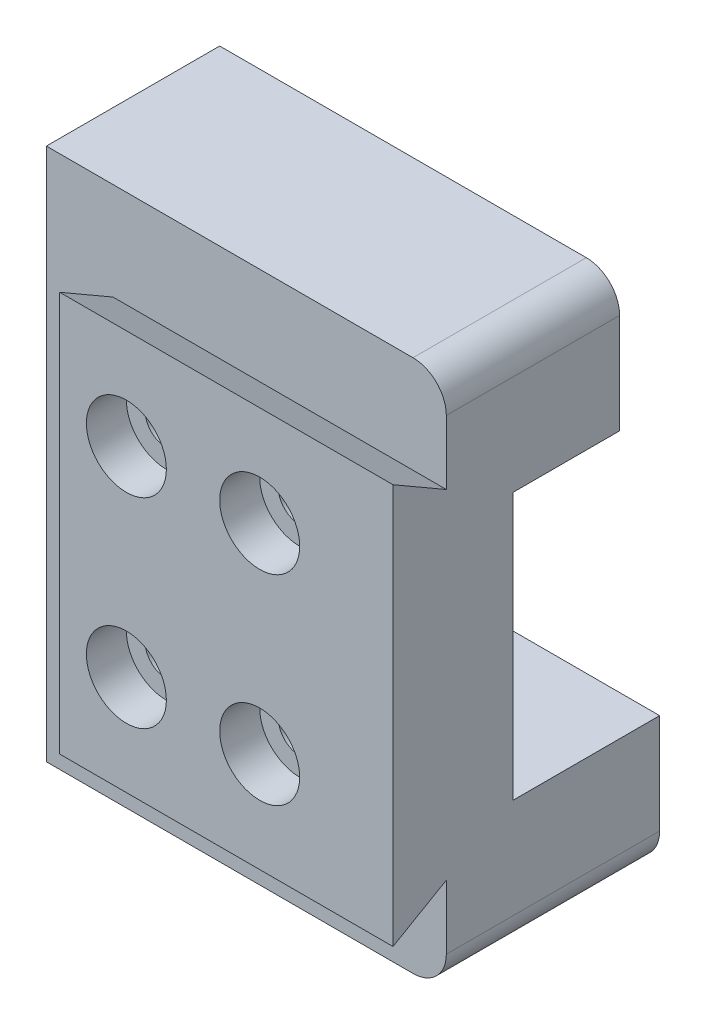
ISO-10303-21;
HEADER;
FILE_DESCRIPTION(('STEP AP214'),'2;1');
FILE_NAME('part.step','',(''),(''),'','','');
FILE_SCHEMA(('AUTOMOTIVE_DESIGN { 1 0 10303 214 1 1 1 1 }'));
ENDSEC;
DATA;
#1=APPLICATION_CONTEXT('core data for automotive mechanical design processes');
#2=APPLICATION_PROTOCOL_DEFINITION('international standard','automotive_design',2000,#1);
#3=PRODUCT_CONTEXT('',#1,'mechanical');
#4=PRODUCT('Part','Part','',(#3));
#5=PRODUCT_RELATED_PRODUCT_CATEGORY('part','',(#4));
#6=PRODUCT_DEFINITION_FORMATION('','',#4);
#7=PRODUCT_DEFINITION_CONTEXT('part definition',#1,'design');
#8=PRODUCT_DEFINITION('design','',#6,#7);
#9=PRODUCT_DEFINITION_SHAPE('','',#8);
#10=(LENGTH_UNIT() NAMED_UNIT(*) SI_UNIT(.MILLI.,.METRE.));
#11=(NAMED_UNIT(*) PLANE_ANGLE_UNIT() SI_UNIT($,.RADIAN.));
#12=(NAMED_UNIT(*) SI_UNIT($,.STERADIAN.) SOLID_ANGLE_UNIT());
#13=UNCERTAINTY_MEASURE_WITH_UNIT(LENGTH_MEASURE(1.E-05),#10,'distance_accuracy_value','');
#14=(GEOMETRIC_REPRESENTATION_CONTEXT(3) GLOBAL_UNCERTAINTY_ASSIGNED_CONTEXT((#13)) GLOBAL_UNIT_ASSIGNED_CONTEXT((#10,
#11,#12)) REPRESENTATION_CONTEXT('',''));
#15=CARTESIAN_POINT('',(0.,0.,0.));
#16=DIRECTION('',(0.,0.,1.));
#17=DIRECTION('',(1.,0.,0.));
#18=AXIS2_PLACEMENT_3D('',#15,#16,#17);
#19=CARTESIAN_POINT('',(0.,0.,5.));
#20=DIRECTION('',(0.,0.,1.));
#21=DIRECTION('',(1.,0.,0.));
#22=AXIS2_PLACEMENT_3D('',#19,#20,#21);
#23=PLANE('',#22);
#24=CARTESIAN_POINT('',(12.5,-17.5,5.));
#25=DIRECTION('',(0.,0.,-1.));
#26=DIRECTION('',(0.707106781186548,-0.707106781186548,0.));
#27=AXIS2_PLACEMENT_3D('',#24,#25,#26);
#28=CIRCLE('',#27,2.5);
#29=CARTESIAN_POINT('',(15.,-17.5,5.));
#30=VERTEX_POINT('',#29);
#31=CARTESIAN_POINT('',(12.5,-20.,5.));
#32=VERTEX_POINT('',#31);
#33=EDGE_CURVE('E425',#30,#32,#28,.T.);
#34=ORIENTED_EDGE('',*,*,#33,.F.);
#35=DIRECTION('',(0.,1.,0.));
#36=VECTOR('',#35,1.);
#37=CARTESIAN_POINT('',(15.,20.,5.));
#38=LINE('',#37,#36);
#39=CARTESIAN_POINT('',(15.,-12.6905988458128,5.));
#40=VERTEX_POINT('',#39);
#41=EDGE_CURVE('E381',#30,#40,#38,.T.);
#42=ORIENTED_EDGE('',*,*,#41,.T.);
#43=DIRECTION('',(-1.,0.,0.));
#44=VECTOR('',#43,1.);
#45=CARTESIAN_POINT('',(7.5,-12.6905988458128,5.));
#46=LINE('',#45,#44);
#47=CARTESIAN_POINT('',(-10.,-12.6905988458128,5.));
#48=VERTEX_POINT('',#47);
#49=EDGE_CURVE('E80',#40,#48,#46,.T.);
#50=ORIENTED_EDGE('',*,*,#49,.T.);
#51=DIRECTION('',(0.,1.,0.));
#52=VECTOR('',#51,1.);
#53=CARTESIAN_POINT('',(-10.,0.,5.));
#54=LINE('',#53,#52);
#55=CARTESIAN_POINT('',(-10.,12.6905988458128,5.));
#56=VERTEX_POINT('',#55);
#57=EDGE_CURVE('E70',#48,#56,#54,.T.);
#58=ORIENTED_EDGE('',*,*,#57,.T.);
#59=DIRECTION('',(1.,0.,0.));
#60=VECTOR('',#59,1.);
#61=CARTESIAN_POINT('',(7.5,12.6905988458128,5.));
#62=LINE('',#61,#60);
#63=CARTESIAN_POINT('',(15.,12.6905988458128,5.));
#64=VERTEX_POINT('',#63);
#65=EDGE_CURVE('E76',#56,#64,#62,.T.);
#66=ORIENTED_EDGE('',*,*,#65,.T.);
#67=DIRECTION('',(0.,1.,0.));
#68=VECTOR('',#67,1.);
#69=CARTESIAN_POINT('',(15.,20.,5.));
#70=LINE('',#69,#68);
#71=CARTESIAN_POINT('',(15.,17.5,5.));
#72=VERTEX_POINT('',#71);
#73=EDGE_CURVE('E343',#64,#72,#70,.T.);
#74=ORIENTED_EDGE('',*,*,#73,.T.);
#75=CARTESIAN_POINT('',(12.5,17.5,5.));
#76=DIRECTION('',(0.,0.,-1.));
#77=DIRECTION('',(0.707106781186548,0.707106781186548,0.));
#78=AXIS2_PLACEMENT_3D('',#75,#76,#77);
#79=CIRCLE('',#78,2.5);
#80=CARTESIAN_POINT('',(12.5,20.,5.));
#81=VERTEX_POINT('',#80);
#82=EDGE_CURVE('E421',#81,#72,#79,.T.);
#83=ORIENTED_EDGE('',*,*,#82,.F.);
#84=DIRECTION('',(-1.,0.,0.));
#85=VECTOR('',#84,1.);
#86=CARTESIAN_POINT('',(-15.,20.,5.));
#87=LINE('',#86,#85);
#88=CARTESIAN_POINT('',(-15.,20.,5.));
#89=VERTEX_POINT('',#88);
#90=EDGE_CURVE('E202',#81,#89,#87,.T.);
#91=ORIENTED_EDGE('',*,*,#90,.T.);
#92=DIRECTION('',(0.,-1.,0.));
#93=VECTOR('',#92,1.);
#94=CARTESIAN_POINT('',(-15.,-20.,5.));
#95=LINE('',#94,#93);
#96=CARTESIAN_POINT('',(-15.,-20.,5.));
#97=VERTEX_POINT('',#96);
#98=EDGE_CURVE('E11',#89,#97,#95,.T.);
#99=ORIENTED_EDGE('',*,*,#98,.T.);
#100=DIRECTION('',(1.,0.,0.));
#101=VECTOR('',#100,1.);
#102=CARTESIAN_POINT('',(15.,-20.,5.));
#103=LINE('',#102,#101);
#104=EDGE_CURVE('E20',#97,#32,#103,.T.);
#105=ORIENTED_EDGE('',*,*,#104,.T.);
#106=EDGE_LOOP('',(#34,#42,#50,#58,#66,#74,#83,#91,#99,#105));
#107=FACE_BOUND('',#106,.T.);
#108=ADVANCED_FACE('F17',(#107),#23,.T.);
#109=CARTESIAN_POINT('',(-15.,20.,0.));
#110=DIRECTION('',(-1.,0.,0.));
#111=DIRECTION('',(0.,1.,0.));
#112=AXIS2_PLACEMENT_3D('',#109,#110,#111);
#113=PLANE('',#112);
#114=DIRECTION('',(0.,-1.,0.));
#115=VECTOR('',#114,1.);
#116=CARTESIAN_POINT('',(-15.,17.5,-8.));
#117=LINE('',#116,#115);
#118=CARTESIAN_POINT('',(-15.,20.,-8.));
#119=VERTEX_POINT('',#118);
#120=CARTESIAN_POINT('',(-15.,10.,-8.));
#121=VERTEX_POINT('',#120);
#122=EDGE_CURVE('E362',#119,#121,#117,.T.);
#123=ORIENTED_EDGE('',*,*,#122,.T.);
#124=DIRECTION('',(0.,0.,-1.));
#125=VECTOR('',#124,1.);
#126=CARTESIAN_POINT('',(-15.,10.,0.));
#127=LINE('',#126,#125);
#128=CARTESIAN_POINT('',(-15.,10.,0.));
#129=VERTEX_POINT('',#128);
#130=EDGE_CURVE('E366',#129,#121,#127,.T.);
#131=ORIENTED_EDGE('',*,*,#130,.F.);
#132=DIRECTION('',(0.,1.,0.));
#133=VECTOR('',#132,1.);
#134=CARTESIAN_POINT('',(-15.,-20.,0.));
#135=LINE('',#134,#133);
#136=CARTESIAN_POINT('',(-15.,-10.,0.));
#137=VERTEX_POINT('',#136);
#138=EDGE_CURVE('E160',#137,#129,#135,.T.);
#139=ORIENTED_EDGE('',*,*,#138,.F.);
#140=DIRECTION('',(0.,0.,-1.));
#141=VECTOR('',#140,1.);
#142=CARTESIAN_POINT('',(-15.,-10.,0.));
#143=LINE('',#142,#141);
#144=CARTESIAN_POINT('',(-15.,-10.,-11.));
#145=VERTEX_POINT('',#144);
#146=EDGE_CURVE('E50',#137,#145,#143,.T.);
#147=ORIENTED_EDGE('',*,*,#146,.T.);
#148=DIRECTION('',(0.,1.,0.));
#149=VECTOR('',#148,1.);
#150=CARTESIAN_POINT('',(-15.,-20.,-11.));
#151=LINE('',#150,#149);
#152=CARTESIAN_POINT('',(-15.,-20.,-11.));
#153=VERTEX_POINT('',#152);
#154=EDGE_CURVE('E179',#153,#145,#151,.T.);
#155=ORIENTED_EDGE('',*,*,#154,.F.);
#156=DIRECTION('',(0.,0.,1.));
#157=VECTOR('',#156,1.);
#158=CARTESIAN_POINT('',(-15.,-20.,0.));
#159=LINE('',#158,#157);
#160=EDGE_CURVE('E26',#153,#97,#159,.T.);
#161=ORIENTED_EDGE('',*,*,#160,.T.);
#162=ORIENTED_EDGE('',*,*,#98,.F.);
#163=DIRECTION('',(0.,0.,1.));
#164=VECTOR('',#163,1.);
#165=CARTESIAN_POINT('',(-15.,20.,0.));
#166=LINE('',#165,#164);
#167=EDGE_CURVE('E196',#119,#89,#166,.T.);
#168=ORIENTED_EDGE('',*,*,#167,.F.);
#169=EDGE_LOOP('',(#123,#131,#139,#147,#155,#161,#162,#168));
#170=FACE_BOUND('',#169,.T.);
#171=ADVANCED_FACE('F253',(#170),#113,.T.);
#172=CARTESIAN_POINT('',(-15.,-20.,0.));
#173=DIRECTION('',(0.,-1.,0.));
#174=DIRECTION('',(0.,0.,-1.));
#175=AXIS2_PLACEMENT_3D('',#172,#173,#174);
#176=PLANE('',#175);
#177=DIRECTION('',(0.,0.,-1.));
#178=VECTOR('',#177,1.);
#179=CARTESIAN_POINT('',(12.5,-20.,0.));
#180=LINE('',#179,#178);
#181=CARTESIAN_POINT('',(12.5,-20.,-11.));
#182=VERTEX_POINT('',#181);
#183=EDGE_CURVE('E417',#32,#182,#180,.T.);
#184=ORIENTED_EDGE('',*,*,#183,.F.);
#185=ORIENTED_EDGE('',*,*,#104,.F.);
#186=ORIENTED_EDGE('',*,*,#160,.F.);
#187=DIRECTION('',(-1.,0.,0.));
#188=VECTOR('',#187,1.);
#189=CARTESIAN_POINT('',(15.,-20.,-11.));
#190=LINE('',#189,#188);
#191=EDGE_CURVE('E391',#182,#153,#190,.T.);
#192=ORIENTED_EDGE('',*,*,#191,.F.);
#193=EDGE_LOOP('',(#184,#185,#186,#192));
#194=FACE_BOUND('',#193,.T.);
#195=ADVANCED_FACE('F257',(#194),#176,.T.);
#196=CARTESIAN_POINT('',(-15.,-10.,0.));
#197=DIRECTION('',(0.,1.,0.));
#198=DIRECTION('',(1.,0.,0.));
#199=AXIS2_PLACEMENT_3D('',#196,#197,#198);
#200=PLANE('',#199);
#201=DIRECTION('',(-1.,0.,0.));
#202=VECTOR('',#201,1.);
#203=CARTESIAN_POINT('',(-7.5,-10.,0.));
#204=LINE('',#203,#202);
#205=CARTESIAN_POINT('',(15.,-10.,0.));
#206=VERTEX_POINT('',#205);
#207=EDGE_CURVE('E85',#206,#137,#204,.T.);
#208=ORIENTED_EDGE('',*,*,#207,.F.);
#209=DIRECTION('',(0.,0.,-1.));
#210=VECTOR('',#209,1.);
#211=CARTESIAN_POINT('',(15.,-10.,0.));
#212=LINE('',#211,#210);
#213=CARTESIAN_POINT('',(15.,-10.,-11.));
#214=VERTEX_POINT('',#213);
#215=EDGE_CURVE('E375',#206,#214,#212,.T.);
#216=ORIENTED_EDGE('',*,*,#215,.T.);
#217=DIRECTION('',(1.,0.,0.));
#218=VECTOR('',#217,1.);
#219=CARTESIAN_POINT('',(15.,-10.,-11.));
#220=LINE('',#219,#218);
#221=EDGE_CURVE('E181',#145,#214,#220,.T.);
#222=ORIENTED_EDGE('',*,*,#221,.F.);
#223=ORIENTED_EDGE('',*,*,#146,.F.);
#224=EDGE_LOOP('',(#208,#216,#222,#223));
#225=FACE_BOUND('',#224,.T.);
#226=ADVANCED_FACE('F261',(#225),#200,.T.);
#227=CARTESIAN_POINT('',(0.,0.,0.));
#228=DIRECTION('',(0.,0.,1.));
#229=DIRECTION('',(1.,0.,0.));
#230=AXIS2_PLACEMENT_3D('',#227,#228,#229);
#231=PLANE('',#230);
#232=CARTESIAN_POINT('',(5.,-7.5,0.));
#233=DIRECTION('',(0.,0.,1.));
#234=DIRECTION('',(1.,0.,0.));
#235=AXIS2_PLACEMENT_3D('',#232,#233,#234);
#236=CIRCLE('',#235,1.6);
#237=CARTESIAN_POINT('',(6.6,-7.5,0.));
#238=VERTEX_POINT('',#237);
#239=EDGE_CURVE('E156',#238,#238,#236,.T.);
#240=ORIENTED_EDGE('',*,*,#239,.T.);
#241=EDGE_LOOP('',(#240));
#242=FACE_BOUND('',#241,.T.);
#243=CARTESIAN_POINT('',(5.,7.5,0.));
#244=DIRECTION('',(0.,0.,1.));
#245=DIRECTION('',(1.,0.,0.));
#246=AXIS2_PLACEMENT_3D('',#243,#244,#245);
#247=CIRCLE('',#246,1.6);
#248=CARTESIAN_POINT('',(6.6,7.5,0.));
#249=VERTEX_POINT('',#248);
#250=EDGE_CURVE('E117',#249,#249,#247,.T.);
#251=ORIENTED_EDGE('',*,*,#250,.T.);
#252=EDGE_LOOP('',(#251));
#253=FACE_BOUND('',#252,.T.);
#254=CARTESIAN_POINT('',(-5.,7.5,0.));
#255=DIRECTION('',(0.,0.,1.));
#256=DIRECTION('',(1.,0.,0.));
#257=AXIS2_PLACEMENT_3D('',#254,#255,#256);
#258=CIRCLE('',#257,1.6);
#259=CARTESIAN_POINT('',(-3.4,7.5,0.));
#260=VERTEX_POINT('',#259);
#261=EDGE_CURVE('E136',#260,#260,#258,.T.);
#262=ORIENTED_EDGE('',*,*,#261,.T.);
#263=EDGE_LOOP('',(#262));
#264=FACE_BOUND('',#263,.T.);
#265=CARTESIAN_POINT('',(-5.,-7.5,0.));
#266=DIRECTION('',(0.,0.,1.));
#267=DIRECTION('',(1.,0.,0.));
#268=AXIS2_PLACEMENT_3D('',#265,#266,#267);
#269=CIRCLE('',#268,1.6);
#270=CARTESIAN_POINT('',(-3.4,-7.5,0.));
#271=VERTEX_POINT('',#270);
#272=EDGE_CURVE('E119',#271,#271,#269,.T.);
#273=ORIENTED_EDGE('',*,*,#272,.T.);
#274=EDGE_LOOP('',(#273));
#275=FACE_BOUND('',#274,.T.);
#276=DIRECTION('',(1.,0.,0.));
#277=VECTOR('',#276,1.);
#278=CARTESIAN_POINT('',(7.5,10.,0.));
#279=LINE('',#278,#277);
#280=CARTESIAN_POINT('',(15.,10.,0.));
#281=VERTEX_POINT('',#280);
#282=EDGE_CURVE('E396',#129,#281,#279,.T.);
#283=ORIENTED_EDGE('',*,*,#282,.T.);
#284=DIRECTION('',(0.,-1.,0.));
#285=VECTOR('',#284,1.);
#286=CARTESIAN_POINT('',(15.,20.,0.));
#287=LINE('',#286,#285);
#288=EDGE_CURVE('E370',#281,#206,#287,.T.);
#289=ORIENTED_EDGE('',*,*,#288,.T.);
#290=ORIENTED_EDGE('',*,*,#207,.T.);
#291=ORIENTED_EDGE('',*,*,#138,.T.);
#292=EDGE_LOOP('',(#283,#289,#290,#291));
#293=FACE_BOUND('',#292,.T.);
#294=ADVANCED_FACE('F268',(#242,#253,#264,#275,#293),#231,.F.);
#295=CARTESIAN_POINT('',(-10.,0.,7.00000006705522));
#296=DIRECTION('',(-1.,0.,0.));
#297=DIRECTION('',(0.,0.,1.));
#298=AXIS2_PLACEMENT_3D('',#295,#296,#297);
#299=PLANE('',#298);
#300=DIRECTION('',(0.,1.,0.));
#301=VECTOR('',#300,1.);
#302=CARTESIAN_POINT('',(-10.,0.,9.00000013411045));
#303=LINE('',#302,#301);
#304=CARTESIAN_POINT('',(-10.,-15.,9.00000013411045));
#305=VERTEX_POINT('',#304);
#306=CARTESIAN_POINT('',(-10.,15.,9.00000013411045));
#307=VERTEX_POINT('',#306);
#308=EDGE_CURVE('E86',#305,#307,#303,.T.);
#309=ORIENTED_EDGE('',*,*,#308,.T.);
#310=DIRECTION('',(0.,-0.5,-0.866025403784439));
#311=VECTOR('',#310,1.);
#312=CARTESIAN_POINT('',(-10.,15.,9.00000013411045));
#313=LINE('',#312,#311);
#314=EDGE_CURVE('E89',#307,#56,#313,.T.);
#315=ORIENTED_EDGE('',*,*,#314,.T.);
#316=ORIENTED_EDGE('',*,*,#57,.F.);
#317=DIRECTION('',(0.,-0.5,0.866025403784439));
#318=VECTOR('',#317,1.);
#319=CARTESIAN_POINT('',(-10.,-15.,9.00000013411045));
#320=LINE('',#319,#318);
#321=EDGE_CURVE('E107',#48,#305,#320,.T.);
#322=ORIENTED_EDGE('',*,*,#321,.T.);
#323=EDGE_LOOP('',(#309,#315,#316,#322));
#324=FACE_BOUND('',#323,.T.);
#325=ADVANCED_FACE('F90',(#324),#299,.T.);
#326=CARTESIAN_POINT('',(15.,-15.,9.00000013411045));
#327=DIRECTION('',(0.,0.,1.));
#328=DIRECTION('',(0.,-1.,0.));
#329=AXIS2_PLACEMENT_3D('',#326,#327,#328);
#330=PLANE('',#329);
#331=CARTESIAN_POINT('',(5.,-7.5,9.00000013411045));
#332=DIRECTION('',(0.,0.,-1.));
#333=DIRECTION('',(1.,0.,0.));
#334=AXIS2_PLACEMENT_3D('',#331,#332,#333);
#335=CIRCLE('',#334,3.);
#336=CARTESIAN_POINT('',(8.,-7.5,9.00000013411045));
#337=VERTEX_POINT('',#336);
#338=EDGE_CURVE('E141',#337,#337,#335,.T.);
#339=ORIENTED_EDGE('',*,*,#338,.T.);
#340=EDGE_LOOP('',(#339));
#341=FACE_BOUND('',#340,.T.);
#342=CARTESIAN_POINT('',(5.,7.5,9.00000013411045));
#343=DIRECTION('',(0.,0.,-1.));
#344=DIRECTION('',(1.,0.,0.));
#345=AXIS2_PLACEMENT_3D('',#342,#343,#344);
#346=CIRCLE('',#345,3.);
#347=CARTESIAN_POINT('',(8.,7.5,9.00000013411045));
#348=VERTEX_POINT('',#347);
#349=EDGE_CURVE('E113',#348,#348,#346,.T.);
#350=ORIENTED_EDGE('',*,*,#349,.T.);
#351=EDGE_LOOP('',(#350));
#352=FACE_BOUND('',#351,.T.);
#353=CARTESIAN_POINT('',(-5.,7.5,9.00000013411045));
#354=DIRECTION('',(0.,0.,-1.));
#355=DIRECTION('',(1.,0.,0.));
#356=AXIS2_PLACEMENT_3D('',#353,#354,#355);
#357=CIRCLE('',#356,3.);
#358=CARTESIAN_POINT('',(-2.,7.5,9.00000013411045));
#359=VERTEX_POINT('',#358);
#360=EDGE_CURVE('E132',#359,#359,#357,.T.);
#361=ORIENTED_EDGE('',*,*,#360,.T.);
#362=EDGE_LOOP('',(#361));
#363=FACE_BOUND('',#362,.T.);
#364=CARTESIAN_POINT('',(-5.,-7.5,9.00000013411045));
#365=DIRECTION('',(0.,0.,-1.));
#366=DIRECTION('',(1.,0.,0.));
#367=AXIS2_PLACEMENT_3D('',#364,#365,#366);
#368=CIRCLE('',#367,3.);
#369=CARTESIAN_POINT('',(-2.,-7.5,9.00000013411045));
#370=VERTEX_POINT('',#369);
#371=EDGE_CURVE('E124',#370,#370,#368,.T.);
#372=ORIENTED_EDGE('',*,*,#371,.T.);
#373=EDGE_LOOP('',(#372));
#374=FACE_BOUND('',#373,.T.);
#375=DIRECTION('',(0.,1.,0.));
#376=VECTOR('',#375,1.);
#377=CARTESIAN_POINT('',(15.,0.,9.00000013411045));
#378=LINE('',#377,#376);
#379=CARTESIAN_POINT('',(15.,-15.,9.00000013411045));
#380=VERTEX_POINT('',#379);
#381=CARTESIAN_POINT('',(15.,15.,9.00000013411045));
#382=VERTEX_POINT('',#381);
#383=EDGE_CURVE('E330',#380,#382,#378,.T.);
#384=ORIENTED_EDGE('',*,*,#383,.T.);
#385=DIRECTION('',(-1.,0.,0.));
#386=VECTOR('',#385,1.);
#387=CARTESIAN_POINT('',(15.,15.,9.00000013411045));
#388=LINE('',#387,#386);
#389=EDGE_CURVE('E95',#382,#307,#388,.T.);
#390=ORIENTED_EDGE('',*,*,#389,.T.);
#391=ORIENTED_EDGE('',*,*,#308,.F.);
#392=DIRECTION('',(-1.,0.,0.));
#393=VECTOR('',#392,1.);
#394=CARTESIAN_POINT('',(15.,-15.,9.00000013411045));
#395=LINE('',#394,#393);
#396=EDGE_CURVE('E153',#380,#305,#395,.T.);
#397=ORIENTED_EDGE('',*,*,#396,.F.);
#398=EDGE_LOOP('',(#384,#390,#391,#397));
#399=FACE_BOUND('',#398,.T.);
#400=ADVANCED_FACE('F274',(#341,#352,#363,#374,#399),#330,.T.);
#401=CARTESIAN_POINT('',(15.,15.,9.00000013411045));
#402=DIRECTION('',(0.,0.866025403784439,-0.5));
#403=DIRECTION('',(-1.,0.,0.));
#404=AXIS2_PLACEMENT_3D('',#401,#402,#403);
#405=PLANE('',#404);
#406=DIRECTION('',(0.,-0.5,-0.866025403784439));
#407=VECTOR('',#406,1.);
#408=CARTESIAN_POINT('',(15.,15.,9.00000013411045));
#409=LINE('',#408,#407);
#410=EDGE_CURVE('E99',#382,#64,#409,.T.);
#411=ORIENTED_EDGE('',*,*,#410,.T.);
#412=ORIENTED_EDGE('',*,*,#65,.F.);
#413=ORIENTED_EDGE('',*,*,#314,.F.);
#414=ORIENTED_EDGE('',*,*,#389,.F.);
#415=EDGE_LOOP('',(#411,#412,#413,#414));
#416=FACE_BOUND('',#415,.T.);
#417=ADVANCED_FACE('F97',(#416),#405,.T.);
#418=CARTESIAN_POINT('',(15.,-12.6905988458128,5.));
#419=DIRECTION('',(0.,-0.866025403784439,-0.5));
#420=DIRECTION('',(0.,0.5,-0.866025403784439));
#421=AXIS2_PLACEMENT_3D('',#418,#419,#420);
#422=PLANE('',#421);
#423=DIRECTION('',(0.,0.5,-0.866025403784439));
#424=VECTOR('',#423,1.);
#425=CARTESIAN_POINT('',(15.,-15.,9.00000013411045));
#426=LINE('',#425,#424);
#427=EDGE_CURVE('E338',#380,#40,#426,.T.);
#428=ORIENTED_EDGE('',*,*,#427,.F.);
#429=ORIENTED_EDGE('',*,*,#396,.T.);
#430=ORIENTED_EDGE('',*,*,#321,.F.);
#431=ORIENTED_EDGE('',*,*,#49,.F.);
#432=EDGE_LOOP('',(#428,#429,#430,#431));
#433=FACE_BOUND('',#432,.T.);
#434=ADVANCED_FACE('F280',(#433),#422,.T.);
#435=CARTESIAN_POINT('',(5.,-7.5,-90.4999998658896));
#436=DIRECTION('',(0.,0.,-1.));
#437=DIRECTION('',(1.,0.,0.));
#438=AXIS2_PLACEMENT_3D('',#435,#436,#437);
#439=CYLINDRICAL_SURFACE('',#438,1.6);
#440=ORIENTED_EDGE('',*,*,#239,.F.);
#441=EDGE_LOOP('',(#440));
#442=FACE_BOUND('',#441,.T.);
#443=CARTESIAN_POINT('',(5.,-7.5,6.00000013411044));
#444=DIRECTION('',(0.,0.,-1.));
#445=DIRECTION('',(1.,0.,0.));
#446=AXIS2_PLACEMENT_3D('',#443,#444,#445);
#447=CIRCLE('',#446,1.6);
#448=CARTESIAN_POINT('',(6.6,-7.5,6.00000013411044));
#449=VERTEX_POINT('',#448);
#450=EDGE_CURVE('E137',#449,#449,#447,.T.);
#451=ORIENTED_EDGE('',*,*,#450,.F.);
#452=EDGE_LOOP('',(#451));
#453=FACE_BOUND('',#452,.T.);
#454=ADVANCED_FACE('F283',(#442,#453),#439,.F.);
#455=CARTESIAN_POINT('',(5.,-7.5,7.50000013411045));
#456=DIRECTION('',(0.,0.,-1.));
#457=DIRECTION('',(1.,0.,0.));
#458=AXIS2_PLACEMENT_3D('',#455,#456,#457);
#459=CYLINDRICAL_SURFACE('',#458,3.);
#460=CARTESIAN_POINT('',(5.,-7.5,6.00000013411045));
#461=DIRECTION('',(0.,0.,-1.));
#462=DIRECTION('',(1.,0.,0.));
#463=AXIS2_PLACEMENT_3D('',#460,#461,#462);
#464=CIRCLE('',#463,3.);
#465=CARTESIAN_POINT('',(8.,-7.5,6.00000013411045));
#466=VERTEX_POINT('',#465);
#467=EDGE_CURVE('E142',#466,#466,#464,.T.);
#468=ORIENTED_EDGE('',*,*,#467,.T.);
#469=EDGE_LOOP('',(#468));
#470=FACE_BOUND('',#469,.T.);
#471=ORIENTED_EDGE('',*,*,#338,.F.);
#472=EDGE_LOOP('',(#471));
#473=FACE_BOUND('',#472,.T.);
#474=ADVANCED_FACE('F287',(#470,#473),#459,.F.);
#475=CARTESIAN_POINT('',(5.,-7.5,6.00000013411045));
#476=DIRECTION('',(0.,0.,-1.));
#477=DIRECTION('',(0.,-1.,0.));
#478=AXIS2_PLACEMENT_3D('',#475,#476,#477);
#479=PLANE('',#478);
#480=ORIENTED_EDGE('',*,*,#450,.T.);
#481=EDGE_LOOP('',(#480));
#482=FACE_BOUND('',#481,.T.);
#483=ORIENTED_EDGE('',*,*,#467,.F.);
#484=EDGE_LOOP('',(#483));
#485=FACE_BOUND('',#484,.T.);
#486=ADVANCED_FACE('F289',(#482,#485),#479,.F.);
#487=CARTESIAN_POINT('',(5.,7.5,-90.4999998658896));
#488=DIRECTION('',(0.,0.,-1.));
#489=DIRECTION('',(1.,0.,0.));
#490=AXIS2_PLACEMENT_3D('',#487,#488,#489);
#491=CYLINDRICAL_SURFACE('',#490,1.6);
#492=ORIENTED_EDGE('',*,*,#250,.F.);
#493=EDGE_LOOP('',(#492));
#494=FACE_BOUND('',#493,.T.);
#495=CARTESIAN_POINT('',(5.,7.5,6.00000013411044));
#496=DIRECTION('',(0.,0.,-1.));
#497=DIRECTION('',(1.,0.,0.));
#498=AXIS2_PLACEMENT_3D('',#495,#496,#497);
#499=CIRCLE('',#498,1.6);
#500=CARTESIAN_POINT('',(6.6,7.5,6.00000013411044));
#501=VERTEX_POINT('',#500);
#502=EDGE_CURVE('E118',#501,#501,#499,.T.);
#503=ORIENTED_EDGE('',*,*,#502,.F.);
#504=EDGE_LOOP('',(#503));
#505=FACE_BOUND('',#504,.T.);
#506=ADVANCED_FACE('F292',(#494,#505),#491,.F.);
#507=CARTESIAN_POINT('',(5.,7.5,7.50000013411045));
#508=DIRECTION('',(0.,0.,-1.));
#509=DIRECTION('',(1.,0.,0.));
#510=AXIS2_PLACEMENT_3D('',#507,#508,#509);
#511=CYLINDRICAL_SURFACE('',#510,3.);
#512=CARTESIAN_POINT('',(5.,7.5,6.00000013411045));
#513=DIRECTION('',(0.,0.,-1.));
#514=DIRECTION('',(1.,0.,0.));
#515=AXIS2_PLACEMENT_3D('',#512,#513,#514);
#516=CIRCLE('',#515,3.);
#517=CARTESIAN_POINT('',(8.,7.5,6.00000013411045));
#518=VERTEX_POINT('',#517);
#519=EDGE_CURVE('E143',#518,#518,#516,.T.);
#520=ORIENTED_EDGE('',*,*,#519,.T.);
#521=EDGE_LOOP('',(#520));
#522=FACE_BOUND('',#521,.T.);
#523=ORIENTED_EDGE('',*,*,#349,.F.);
#524=EDGE_LOOP('',(#523));
#525=FACE_BOUND('',#524,.T.);
#526=ADVANCED_FACE('F294',(#522,#525),#511,.F.);
#527=CARTESIAN_POINT('',(5.,7.5,6.00000013411045));
#528=DIRECTION('',(0.,0.,-1.));
#529=DIRECTION('',(0.,-1.,0.));
#530=AXIS2_PLACEMENT_3D('',#527,#528,#529);
#531=PLANE('',#530);
#532=ORIENTED_EDGE('',*,*,#502,.T.);
#533=EDGE_LOOP('',(#532));
#534=FACE_BOUND('',#533,.T.);
#535=ORIENTED_EDGE('',*,*,#519,.F.);
#536=EDGE_LOOP('',(#535));
#537=FACE_BOUND('',#536,.T.);
#538=ADVANCED_FACE('F297',(#534,#537),#531,.F.);
#539=CARTESIAN_POINT('',(-5.,7.5,-90.4999998658896));
#540=DIRECTION('',(0.,0.,-1.));
#541=DIRECTION('',(1.,0.,0.));
#542=AXIS2_PLACEMENT_3D('',#539,#540,#541);
#543=CYLINDRICAL_SURFACE('',#542,1.6);
#544=ORIENTED_EDGE('',*,*,#261,.F.);
#545=EDGE_LOOP('',(#544));
#546=FACE_BOUND('',#545,.T.);
#547=CARTESIAN_POINT('',(-5.,7.5,6.00000013411044));
#548=DIRECTION('',(0.,0.,-1.));
#549=DIRECTION('',(1.,0.,0.));
#550=AXIS2_PLACEMENT_3D('',#547,#548,#549);
#551=CIRCLE('',#550,1.6);
#552=CARTESIAN_POINT('',(-3.4,7.5,6.00000013411044));
#553=VERTEX_POINT('',#552);
#554=EDGE_CURVE('E128',#553,#553,#551,.T.);
#555=ORIENTED_EDGE('',*,*,#554,.F.);
#556=EDGE_LOOP('',(#555));
#557=FACE_BOUND('',#556,.T.);
#558=ADVANCED_FACE('F304',(#546,#557),#543,.F.);
#559=CARTESIAN_POINT('',(-5.,7.5,7.50000013411045));
#560=DIRECTION('',(0.,0.,-1.));
#561=DIRECTION('',(1.,0.,0.));
#562=AXIS2_PLACEMENT_3D('',#559,#560,#561);
#563=CYLINDRICAL_SURFACE('',#562,3.);
#564=CARTESIAN_POINT('',(-5.,7.5,6.00000013411045));
#565=DIRECTION('',(0.,0.,-1.));
#566=DIRECTION('',(1.,0.,0.));
#567=AXIS2_PLACEMENT_3D('',#564,#565,#566);
#568=CIRCLE('',#567,3.);
#569=CARTESIAN_POINT('',(-2.,7.5,6.00000013411045));
#570=VERTEX_POINT('',#569);
#571=EDGE_CURVE('E123',#570,#570,#568,.T.);
#572=ORIENTED_EDGE('',*,*,#571,.T.);
#573=EDGE_LOOP('',(#572));
#574=FACE_BOUND('',#573,.T.);
#575=ORIENTED_EDGE('',*,*,#360,.F.);
#576=EDGE_LOOP('',(#575));
#577=FACE_BOUND('',#576,.T.);
#578=ADVANCED_FACE('F248',(#574,#577),#563,.F.);
#579=CARTESIAN_POINT('',(-5.,7.5,6.00000013411045));
#580=DIRECTION('',(0.,0.,-1.));
#581=DIRECTION('',(0.,-1.,0.));
#582=AXIS2_PLACEMENT_3D('',#579,#580,#581);
#583=PLANE('',#582);
#584=ORIENTED_EDGE('',*,*,#554,.T.);
#585=EDGE_LOOP('',(#584));
#586=FACE_BOUND('',#585,.T.);
#587=ORIENTED_EDGE('',*,*,#571,.F.);
#588=EDGE_LOOP('',(#587));
#589=FACE_BOUND('',#588,.T.);
#590=ADVANCED_FACE('F239',(#586,#589),#583,.F.);
#591=CARTESIAN_POINT('',(-5.,-7.5,-90.4999998658896));
#592=DIRECTION('',(0.,0.,-1.));
#593=DIRECTION('',(1.,0.,0.));
#594=AXIS2_PLACEMENT_3D('',#591,#592,#593);
#595=CYLINDRICAL_SURFACE('',#594,1.6);
#596=ORIENTED_EDGE('',*,*,#272,.F.);
#597=EDGE_LOOP('',(#596));
#598=FACE_BOUND('',#597,.T.);
#599=CARTESIAN_POINT('',(-5.,-7.5,6.00000013411044));
#600=DIRECTION('',(0.,0.,-1.));
#601=DIRECTION('',(1.,0.,0.));
#602=AXIS2_PLACEMENT_3D('',#599,#600,#601);
#603=CIRCLE('',#602,1.6);
#604=CARTESIAN_POINT('',(-3.4,-7.5,6.00000013411044));
#605=VERTEX_POINT('',#604);
#606=EDGE_CURVE('E111',#605,#605,#603,.T.);
#607=ORIENTED_EDGE('',*,*,#606,.F.);
#608=EDGE_LOOP('',(#607));
#609=FACE_BOUND('',#608,.T.);
#610=ADVANCED_FACE('F236',(#598,#609),#595,.F.);
#611=CARTESIAN_POINT('',(-5.,-7.5,7.50000013411045));
#612=DIRECTION('',(0.,0.,-1.));
#613=DIRECTION('',(1.,0.,0.));
#614=AXIS2_PLACEMENT_3D('',#611,#612,#613);
#615=CYLINDRICAL_SURFACE('',#614,3.);
#616=CARTESIAN_POINT('',(-5.,-7.5,6.00000013411045));
#617=DIRECTION('',(0.,0.,-1.));
#618=DIRECTION('',(1.,0.,0.));
#619=AXIS2_PLACEMENT_3D('',#616,#617,#618);
#620=CIRCLE('',#619,3.);
#621=CARTESIAN_POINT('',(-2.,-7.5,6.00000013411045));
#622=VERTEX_POINT('',#621);
#623=EDGE_CURVE('E220',#622,#622,#620,.T.);
#624=ORIENTED_EDGE('',*,*,#623,.T.);
#625=EDGE_LOOP('',(#624));
#626=FACE_BOUND('',#625,.T.);
#627=ORIENTED_EDGE('',*,*,#371,.F.);
#628=EDGE_LOOP('',(#627));
#629=FACE_BOUND('',#628,.T.);
#630=ADVANCED_FACE('F238',(#626,#629),#615,.F.);
#631=CARTESIAN_POINT('',(-5.,-7.5,6.00000013411045));
#632=DIRECTION('',(0.,0.,-1.));
#633=DIRECTION('',(0.,-1.,0.));
#634=AXIS2_PLACEMENT_3D('',#631,#632,#633);
#635=PLANE('',#634);
#636=ORIENTED_EDGE('',*,*,#606,.T.);
#637=EDGE_LOOP('',(#636));
#638=FACE_BOUND('',#637,.T.);
#639=ORIENTED_EDGE('',*,*,#623,.F.);
#640=EDGE_LOOP('',(#639));
#641=FACE_BOUND('',#640,.T.);
#642=ADVANCED_FACE('F233',(#638,#641),#635,.F.);
#643=CARTESIAN_POINT('',(10.,-15.,-7.));
#644=DIRECTION('',(0.,0.,1.));
#645=DIRECTION('',(1.,0.,0.));
#646=AXIS2_PLACEMENT_3D('',#643,#644,#645);
#647=PLANE('',#646);
#648=CARTESIAN_POINT('',(10.,-15.,-7.));
#649=DIRECTION('',(0.,0.,1.));
#650=DIRECTION('',(-1.,0.,0.));
#651=AXIS2_PLACEMENT_3D('',#648,#649,#650);
#652=CIRCLE('',#651,2.);
#653=CARTESIAN_POINT('',(8.,-15.,-7.));
#654=VERTEX_POINT('',#653);
#655=EDGE_CURVE('E215',#654,#654,#652,.T.);
#656=ORIENTED_EDGE('',*,*,#655,.F.);
#657=EDGE_LOOP('',(#656));
#658=FACE_BOUND('',#657,.T.);
#659=ADVANCED_FACE('F587',(#658),#647,.F.);
#660=CARTESIAN_POINT('',(10.,-15.,-9.));
#661=DIRECTION('',(0.,0.,1.));
#662=DIRECTION('',(-1.,0.,0.));
#663=AXIS2_PLACEMENT_3D('',#660,#661,#662);
#664=CYLINDRICAL_SURFACE('',#663,2.);
#665=ORIENTED_EDGE('',*,*,#655,.T.);
#666=EDGE_LOOP('',(#665));
#667=FACE_BOUND('',#666,.T.);
#668=CARTESIAN_POINT('',(10.,-15.,-11.));
#669=DIRECTION('',(0.,0.,1.));
#670=DIRECTION('',(-1.,0.,0.));
#671=AXIS2_PLACEMENT_3D('',#668,#669,#670);
#672=CIRCLE('',#671,2.);
#673=CARTESIAN_POINT('',(8.,-15.,-11.));
#674=VERTEX_POINT('',#673);
#675=EDGE_CURVE('E185',#674,#674,#672,.T.);
#676=ORIENTED_EDGE('',*,*,#675,.F.);
#677=EDGE_LOOP('',(#676));
#678=FACE_BOUND('',#677,.T.);
#679=ADVANCED_FACE('F584',(#667,#678),#664,.F.);
#680=CARTESIAN_POINT('',(-10.,-15.,-7.));
#681=DIRECTION('',(0.,0.,1.));
#682=DIRECTION('',(1.,0.,0.));
#683=AXIS2_PLACEMENT_3D('',#680,#681,#682);
#684=PLANE('',#683);
#685=CARTESIAN_POINT('',(-10.,-15.,-7.));
#686=DIRECTION('',(0.,0.,1.));
#687=DIRECTION('',(-1.,0.,0.));
#688=AXIS2_PLACEMENT_3D('',#685,#686,#687);
#689=CIRCLE('',#688,2.);
#690=CARTESIAN_POINT('',(-12.,-15.,-7.));
#691=VERTEX_POINT('',#690);
#692=EDGE_CURVE('E208',#691,#691,#689,.T.);
#693=ORIENTED_EDGE('',*,*,#692,.F.);
#694=EDGE_LOOP('',(#693));
#695=FACE_BOUND('',#694,.T.);
#696=ADVANCED_FACE('F573',(#695),#684,.F.);
#697=CARTESIAN_POINT('',(-10.,-15.,-9.));
#698=DIRECTION('',(0.,0.,1.));
#699=DIRECTION('',(-1.,0.,0.));
#700=AXIS2_PLACEMENT_3D('',#697,#698,#699);
#701=CYLINDRICAL_SURFACE('',#700,2.);
#702=ORIENTED_EDGE('',*,*,#692,.T.);
#703=EDGE_LOOP('',(#702));
#704=FACE_BOUND('',#703,.T.);
#705=CARTESIAN_POINT('',(-10.,-15.,-11.));
#706=DIRECTION('',(0.,0.,1.));
#707=DIRECTION('',(-1.,0.,0.));
#708=AXIS2_PLACEMENT_3D('',#705,#706,#707);
#709=CIRCLE('',#708,2.);
#710=CARTESIAN_POINT('',(-12.,-15.,-11.));
#711=VERTEX_POINT('',#710);
#712=EDGE_CURVE('E192',#711,#711,#709,.T.);
#713=ORIENTED_EDGE('',*,*,#712,.F.);
#714=EDGE_LOOP('',(#713));
#715=FACE_BOUND('',#714,.T.);
#716=ADVANCED_FACE('F577',(#704,#715),#701,.F.);
#717=CARTESIAN_POINT('',(15.,20.,0.));
#718=DIRECTION('',(0.,1.,0.));
#719=DIRECTION('',(1.,0.,0.));
#720=AXIS2_PLACEMENT_3D('',#717,#718,#719);
#721=PLANE('',#720);
#722=DIRECTION('',(-1.,0.,0.));
#723=VECTOR('',#722,1.);
#724=CARTESIAN_POINT('',(7.5,20.,-8.));
#725=LINE('',#724,#723);
#726=CARTESIAN_POINT('',(12.5,20.,-8.));
#727=VERTEX_POINT('',#726);
#728=EDGE_CURVE('E369',#727,#119,#725,.T.);
#729=ORIENTED_EDGE('',*,*,#728,.T.);
#730=ORIENTED_EDGE('',*,*,#167,.T.);
#731=ORIENTED_EDGE('',*,*,#90,.F.);
#732=DIRECTION('',(0.,0.,1.));
#733=VECTOR('',#732,1.);
#734=CARTESIAN_POINT('',(12.5,20.,0.));
#735=LINE('',#734,#733);
#736=EDGE_CURVE('E374',#727,#81,#735,.T.);
#737=ORIENTED_EDGE('',*,*,#736,.F.);
#738=EDGE_LOOP('',(#729,#730,#731,#737));
#739=FACE_BOUND('',#738,.T.);
#740=ADVANCED_FACE('F492',(#739),#721,.T.);
#741=CARTESIAN_POINT('',(0.,-15.,-11.));
#742=DIRECTION('',(0.,0.,-1.));
#743=DIRECTION('',(0.,-1.,0.));
#744=AXIS2_PLACEMENT_3D('',#741,#742,#743);
#745=PLANE('',#744);
#746=ORIENTED_EDGE('',*,*,#712,.T.);
#747=EDGE_LOOP('',(#746));
#748=FACE_BOUND('',#747,.T.);
#749=ORIENTED_EDGE('',*,*,#675,.T.);
#750=EDGE_LOOP('',(#749));
#751=FACE_BOUND('',#750,.T.);
#752=CARTESIAN_POINT('',(12.5,-17.5,-11.));
#753=DIRECTION('',(0.,0.,1.));
#754=DIRECTION('',(0.707106781186548,-0.707106781186548,0.));
#755=AXIS2_PLACEMENT_3D('',#752,#753,#754);
#756=CIRCLE('',#755,2.5);
#757=CARTESIAN_POINT('',(15.,-17.5,-11.));
#758=VERTEX_POINT('',#757);
#759=EDGE_CURVE('E395',#182,#758,#756,.T.);
#760=ORIENTED_EDGE('',*,*,#759,.F.);
#761=ORIENTED_EDGE('',*,*,#191,.T.);
#762=ORIENTED_EDGE('',*,*,#154,.T.);
#763=ORIENTED_EDGE('',*,*,#221,.T.);
#764=DIRECTION('',(0.,-1.,0.));
#765=VECTOR('',#764,1.);
#766=CARTESIAN_POINT('',(15.,20.,-11.));
#767=LINE('',#766,#765);
#768=EDGE_CURVE('E380',#214,#758,#767,.T.);
#769=ORIENTED_EDGE('',*,*,#768,.T.);
#770=EDGE_LOOP('',(#760,#761,#762,#763,#769));
#771=FACE_BOUND('',#770,.T.);
#772=ADVANCED_FACE('F528',(#748,#751,#771),#745,.T.);
#773=CARTESIAN_POINT('',(12.5,-17.5,0.));
#774=DIRECTION('',(0.,0.,1.));
#775=DIRECTION('',(0.707106781186548,-0.707106781186548,0.));
#776=AXIS2_PLACEMENT_3D('',#773,#774,#775);
#777=CYLINDRICAL_SURFACE('',#776,2.5);
#778=ORIENTED_EDGE('',*,*,#33,.T.);
#779=ORIENTED_EDGE('',*,*,#183,.T.);
#780=ORIENTED_EDGE('',*,*,#759,.T.);
#781=DIRECTION('',(0.,0.,1.));
#782=VECTOR('',#781,1.);
#783=CARTESIAN_POINT('',(15.,-17.5,0.));
#784=LINE('',#783,#782);
#785=EDGE_CURVE('E376',#758,#30,#784,.T.);
#786=ORIENTED_EDGE('',*,*,#785,.T.);
#787=EDGE_LOOP('',(#778,#779,#780,#786));
#788=FACE_BOUND('',#787,.T.);
#789=ADVANCED_FACE('F438',(#788),#777,.T.);
#790=CARTESIAN_POINT('',(12.5,17.5,0.));
#791=DIRECTION('',(0.,0.,-1.));
#792=DIRECTION('',(0.707106781186548,0.707106781186548,0.));
#793=AXIS2_PLACEMENT_3D('',#790,#791,#792);
#794=CYLINDRICAL_SURFACE('',#793,2.5);
#795=CARTESIAN_POINT('',(12.5,17.5,-8.));
#796=DIRECTION('',(0.,0.,1.));
#797=DIRECTION('',(0.707106781186548,0.707106781186548,0.));
#798=AXIS2_PLACEMENT_3D('',#795,#796,#797);
#799=CIRCLE('',#798,2.5);
#800=CARTESIAN_POINT('',(15.,17.5,-8.));
#801=VERTEX_POINT('',#800);
#802=EDGE_CURVE('E353',#801,#727,#799,.T.);
#803=ORIENTED_EDGE('',*,*,#802,.T.);
#804=ORIENTED_EDGE('',*,*,#736,.T.);
#805=ORIENTED_EDGE('',*,*,#82,.T.);
#806=DIRECTION('',(0.,0.,-1.));
#807=VECTOR('',#806,1.);
#808=CARTESIAN_POINT('',(15.,17.5,0.));
#809=LINE('',#808,#807);
#810=EDGE_CURVE('E349',#72,#801,#809,.T.);
#811=ORIENTED_EDGE('',*,*,#810,.T.);
#812=EDGE_LOOP('',(#803,#804,#805,#811));
#813=FACE_BOUND('',#812,.T.);
#814=ADVANCED_FACE('F563',(#813),#794,.T.);
#815=CARTESIAN_POINT('',(15.,-20.,0.));
#816=DIRECTION('',(1.,0.,0.));
#817=DIRECTION('',(0.,1.,0.));
#818=AXIS2_PLACEMENT_3D('',#815,#816,#817);
#819=PLANE('',#818);
#820=DIRECTION('',(0.,1.,0.));
#821=VECTOR('',#820,1.);
#822=CARTESIAN_POINT('',(15.,-2.5,-8.));
#823=LINE('',#822,#821);
#824=CARTESIAN_POINT('',(15.,10.,-8.));
#825=VERTEX_POINT('',#824);
#826=EDGE_CURVE('E355',#825,#801,#823,.T.);
#827=ORIENTED_EDGE('',*,*,#826,.T.);
#828=ORIENTED_EDGE('',*,*,#810,.F.);
#829=ORIENTED_EDGE('',*,*,#73,.F.);
#830=ORIENTED_EDGE('',*,*,#410,.F.);
#831=ORIENTED_EDGE('',*,*,#383,.F.);
#832=ORIENTED_EDGE('',*,*,#427,.T.);
#833=ORIENTED_EDGE('',*,*,#41,.F.);
#834=ORIENTED_EDGE('',*,*,#785,.F.);
#835=ORIENTED_EDGE('',*,*,#768,.F.);
#836=ORIENTED_EDGE('',*,*,#215,.F.);
#837=ORIENTED_EDGE('',*,*,#288,.F.);
#838=DIRECTION('',(0.,0.,-1.));
#839=VECTOR('',#838,1.);
#840=CARTESIAN_POINT('',(15.,10.,0.));
#841=LINE('',#840,#839);
#842=EDGE_CURVE('E386',#281,#825,#841,.T.);
#843=ORIENTED_EDGE('',*,*,#842,.T.);
#844=EDGE_LOOP('',(#827,#828,#829,#830,#831,#832,#833,#834,#835,#836,#837,#843));
#845=FACE_BOUND('',#844,.T.);
#846=ADVANCED_FACE('F341',(#845),#819,.T.);
#847=CARTESIAN_POINT('',(15.,10.,0.));
#848=DIRECTION('',(0.,-1.,0.));
#849=DIRECTION('',(0.,0.,-1.));
#850=AXIS2_PLACEMENT_3D('',#847,#848,#849);
#851=PLANE('',#850);
#852=DIRECTION('',(1.,0.,0.));
#853=VECTOR('',#852,1.);
#854=CARTESIAN_POINT('',(7.5,10.,-8.));
#855=LINE('',#854,#853);
#856=EDGE_CURVE('E357',#121,#825,#855,.T.);
#857=ORIENTED_EDGE('',*,*,#856,.T.);
#858=ORIENTED_EDGE('',*,*,#842,.F.);
#859=ORIENTED_EDGE('',*,*,#282,.F.);
#860=ORIENTED_EDGE('',*,*,#130,.T.);
#861=EDGE_LOOP('',(#857,#858,#859,#860));
#862=FACE_BOUND('',#861,.T.);
#863=ADVANCED_FACE('F530',(#862),#851,.T.);
#864=CARTESIAN_POINT('',(0.,15.,-8.));
#865=DIRECTION('',(0.,0.,-1.));
#866=DIRECTION('',(0.,-1.,0.));
#867=AXIS2_PLACEMENT_3D('',#864,#865,#866);
#868=PLANE('',#867);
#869=ORIENTED_EDGE('',*,*,#802,.F.);
#870=ORIENTED_EDGE('',*,*,#826,.F.);
#871=ORIENTED_EDGE('',*,*,#856,.F.);
#872=ORIENTED_EDGE('',*,*,#122,.F.);
#873=ORIENTED_EDGE('',*,*,#728,.F.);
#874=EDGE_LOOP('',(#869,#870,#871,#872,#873));
#875=FACE_BOUND('',#874,.T.);
#876=ADVANCED_FACE('F500',(#875),#868,.T.);
#877=CLOSED_SHELL('',(#108,#171,#195,#226,#294,#325,#400,#417,#434,#454,#474,#486,#506,#526,
#538,#558,#578,#590,#610,#630,#642,#659,#679,#696,#716,#740,#772,#789,#814,#846,#863,#876));
#878=MANIFOLD_SOLID_BREP('B1',#877);
#879=ADVANCED_BREP_SHAPE_REPRESENTATION('',(#18,#878),#14);
#880=SHAPE_DEFINITION_REPRESENTATION(#9,#879);
ENDSEC;
END-ISO-10303-21;
